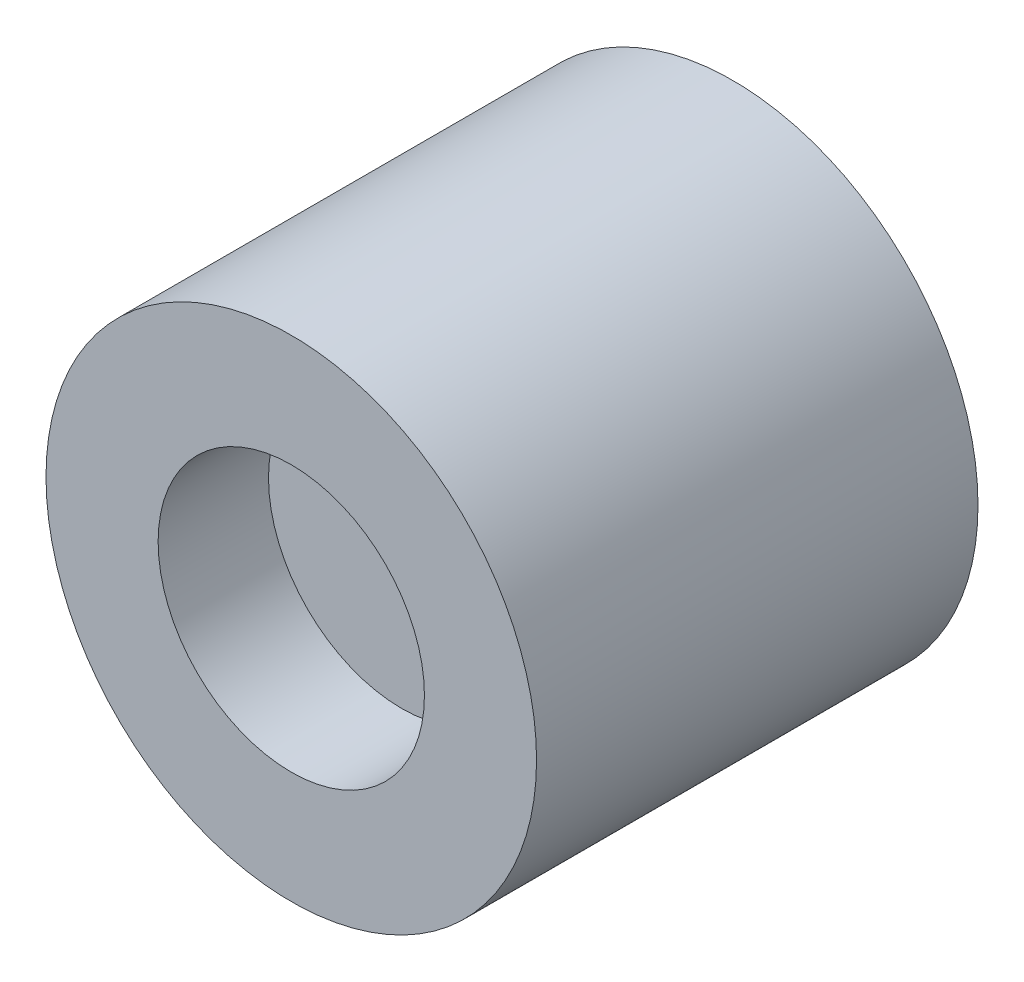
ISO-10303-21;
HEADER;
FILE_DESCRIPTION(('STEP AP214'),'2;1');
FILE_NAME('part.step','',(''),(''),'','','');
FILE_SCHEMA(('AUTOMOTIVE_DESIGN { 1 0 10303 214 1 1 1 1 }'));
ENDSEC;
DATA;
#1=APPLICATION_CONTEXT('core data for automotive mechanical design processes');
#2=APPLICATION_PROTOCOL_DEFINITION('international standard','automotive_design',2000,#1);
#3=PRODUCT_CONTEXT('',#1,'mechanical');
#4=PRODUCT('Part','Part','',(#3));
#5=PRODUCT_RELATED_PRODUCT_CATEGORY('part','',(#4));
#6=PRODUCT_DEFINITION_FORMATION('','',#4);
#7=PRODUCT_DEFINITION_CONTEXT('part definition',#1,'design');
#8=PRODUCT_DEFINITION('design','',#6,#7);
#9=PRODUCT_DEFINITION_SHAPE('','',#8);
#10=(LENGTH_UNIT() NAMED_UNIT(*) SI_UNIT(.MILLI.,.METRE.));
#11=(NAMED_UNIT(*) PLANE_ANGLE_UNIT() SI_UNIT($,.RADIAN.));
#12=(NAMED_UNIT(*) SI_UNIT($,.STERADIAN.) SOLID_ANGLE_UNIT());
#13=UNCERTAINTY_MEASURE_WITH_UNIT(LENGTH_MEASURE(1.E-05),#10,'distance_accuracy_value','');
#14=(GEOMETRIC_REPRESENTATION_CONTEXT(3) GLOBAL_UNCERTAINTY_ASSIGNED_CONTEXT((#13)) GLOBAL_UNIT_ASSIGNED_CONTEXT((#10,
#11,#12)) REPRESENTATION_CONTEXT('',''));
#15=CARTESIAN_POINT('',(0.,0.,0.));
#16=DIRECTION('',(0.,0.,1.));
#17=DIRECTION('',(1.,0.,0.));
#18=AXIS2_PLACEMENT_3D('',#15,#16,#17);
#19=CARTESIAN_POINT('',(0.,0.,8.));
#20=DIRECTION('',(0.,0.,-1.));
#21=DIRECTION('',(-1.,0.,0.));
#22=AXIS2_PLACEMENT_3D('',#19,#20,#21);
#23=CYLINDRICAL_SURFACE('',#22,4.445);
#24=CARTESIAN_POINT('',(0.,0.,8.));
#25=DIRECTION('',(0.,0.,1.));
#26=DIRECTION('',(1.,0.,0.));
#27=AXIS2_PLACEMENT_3D('',#24,#25,#26);
#28=CIRCLE('',#27,4.445);
#29=CARTESIAN_POINT('',(4.445,0.,8.));
#30=VERTEX_POINT('',#29);
#31=EDGE_CURVE('E10',#30,#30,#28,.T.);
#32=ORIENTED_EDGE('',*,*,#31,.F.);
#33=EDGE_LOOP('',(#32));
#34=FACE_BOUND('',#33,.T.);
#35=CARTESIAN_POINT('',(0.,0.,0.));
#36=DIRECTION('',(0.,0.,1.));
#37=DIRECTION('',(1.,0.,0.));
#38=AXIS2_PLACEMENT_3D('',#35,#36,#37);
#39=CIRCLE('',#38,4.445);
#40=CARTESIAN_POINT('',(4.445,0.,0.));
#41=VERTEX_POINT('',#40);
#42=EDGE_CURVE('E46',#41,#41,#39,.T.);
#43=ORIENTED_EDGE('',*,*,#42,.T.);
#44=EDGE_LOOP('',(#43));
#45=FACE_BOUND('',#44,.T.);
#46=ADVANCED_FACE('F43',(#34,#45),#23,.T.);
#47=CARTESIAN_POINT('',(0.,0.,8.));
#48=DIRECTION('',(0.,0.,1.));
#49=DIRECTION('',(1.,0.,0.));
#50=AXIS2_PLACEMENT_3D('',#47,#48,#49);
#51=PLANE('',#50);
#52=CARTESIAN_POINT('',(0.,0.,8.));
#53=DIRECTION('',(0.,0.,1.));
#54=DIRECTION('',(1.,0.,0.));
#55=AXIS2_PLACEMENT_3D('',#52,#53,#54);
#56=CIRCLE('',#55,2.413);
#57=CARTESIAN_POINT('',(2.413,0.,8.));
#58=VERTEX_POINT('',#57);
#59=EDGE_CURVE('E61',#58,#58,#56,.T.);
#60=ORIENTED_EDGE('',*,*,#59,.F.);
#61=EDGE_LOOP('',(#60));
#62=FACE_BOUND('',#61,.T.);
#63=ORIENTED_EDGE('',*,*,#31,.T.);
#64=EDGE_LOOP('',(#63));
#65=FACE_BOUND('',#64,.T.);
#66=ADVANCED_FACE('F76',(#62,#65),#51,.T.);
#67=CARTESIAN_POINT('',(0.,0.,0.));
#68=DIRECTION('',(0.,0.,1.));
#69=DIRECTION('',(1.,0.,0.));
#70=AXIS2_PLACEMENT_3D('',#67,#68,#69);
#71=PLANE('',#70);
#72=CARTESIAN_POINT('',(0.,0.,0.));
#73=DIRECTION('',(0.,0.,-1.));
#74=DIRECTION('',(-1.,0.,0.));
#75=AXIS2_PLACEMENT_3D('',#72,#73,#74);
#76=CIRCLE('',#75,2.4765);
#77=CARTESIAN_POINT('',(-2.4765,0.,0.));
#78=VERTEX_POINT('',#77);
#79=EDGE_CURVE('E55',#78,#78,#76,.T.);
#80=ORIENTED_EDGE('',*,*,#79,.F.);
#81=EDGE_LOOP('',(#80));
#82=FACE_BOUND('',#81,.T.);
#83=ORIENTED_EDGE('',*,*,#42,.F.);
#84=EDGE_LOOP('',(#83));
#85=FACE_BOUND('',#84,.T.);
#86=ADVANCED_FACE('F78',(#82,#85),#71,.F.);
#87=CARTESIAN_POINT('',(0.,0.,3.));
#88=DIRECTION('',(0.,0.,-1.));
#89=DIRECTION('',(-1.,0.,0.));
#90=AXIS2_PLACEMENT_3D('',#87,#88,#89);
#91=CYLINDRICAL_SURFACE('',#90,2.4765);
#92=CARTESIAN_POINT('',(0.,0.,3.));
#93=DIRECTION('',(0.,0.,-1.));
#94=DIRECTION('',(-1.,0.,0.));
#95=AXIS2_PLACEMENT_3D('',#92,#93,#94);
#96=CIRCLE('',#95,2.4765);
#97=CARTESIAN_POINT('',(-2.4765,0.,3.));
#98=VERTEX_POINT('',#97);
#99=EDGE_CURVE('E53',#98,#98,#96,.T.);
#100=ORIENTED_EDGE('',*,*,#99,.F.);
#101=EDGE_LOOP('',(#100));
#102=FACE_BOUND('',#101,.T.);
#103=ORIENTED_EDGE('',*,*,#79,.T.);
#104=EDGE_LOOP('',(#103));
#105=FACE_BOUND('',#104,.T.);
#106=ADVANCED_FACE('F84',(#102,#105),#91,.F.);
#107=CARTESIAN_POINT('',(0.,0.,3.));
#108=DIRECTION('',(0.,0.,-1.));
#109=DIRECTION('',(-1.,0.,0.));
#110=AXIS2_PLACEMENT_3D('',#107,#108,#109);
#111=PLANE('',#110);
#112=ORIENTED_EDGE('',*,*,#99,.T.);
#113=EDGE_LOOP('',(#112));
#114=FACE_BOUND('',#113,.T.);
#115=ADVANCED_FACE('F72',(#114),#111,.T.);
#116=CARTESIAN_POINT('',(0.,0.,6.));
#117=DIRECTION('',(0.,0.,1.));
#118=DIRECTION('',(1.,0.,0.));
#119=AXIS2_PLACEMENT_3D('',#116,#117,#118);
#120=CYLINDRICAL_SURFACE('',#119,2.413);
#121=CARTESIAN_POINT('',(0.,0.,6.));
#122=DIRECTION('',(0.,0.,1.));
#123=DIRECTION('',(1.,0.,0.));
#124=AXIS2_PLACEMENT_3D('',#121,#122,#123);
#125=CIRCLE('',#124,2.413);
#126=CARTESIAN_POINT('',(2.413,0.,6.));
#127=VERTEX_POINT('',#126);
#128=EDGE_CURVE('E58',#127,#127,#125,.T.);
#129=ORIENTED_EDGE('',*,*,#128,.F.);
#130=EDGE_LOOP('',(#129));
#131=FACE_BOUND('',#130,.T.);
#132=ORIENTED_EDGE('',*,*,#59,.T.);
#133=EDGE_LOOP('',(#132));
#134=FACE_BOUND('',#133,.T.);
#135=ADVANCED_FACE('F69',(#131,#134),#120,.F.);
#136=CARTESIAN_POINT('',(0.,0.,6.));
#137=DIRECTION('',(0.,0.,1.));
#138=DIRECTION('',(1.,0.,0.));
#139=AXIS2_PLACEMENT_3D('',#136,#137,#138);
#140=PLANE('',#139);
#141=ORIENTED_EDGE('',*,*,#128,.T.);
#142=EDGE_LOOP('',(#141));
#143=FACE_BOUND('',#142,.T.);
#144=ADVANCED_FACE('F67',(#143),#140,.T.);
#145=CLOSED_SHELL('',(#46,#66,#86,#106,#115,#135,#144));
#146=MANIFOLD_SOLID_BREP('B2',#145);
#147=ADVANCED_BREP_SHAPE_REPRESENTATION('',(#18,#146),#14);
#148=SHAPE_DEFINITION_REPRESENTATION(#9,#147);
ENDSEC;
END-ISO-10303-21;
